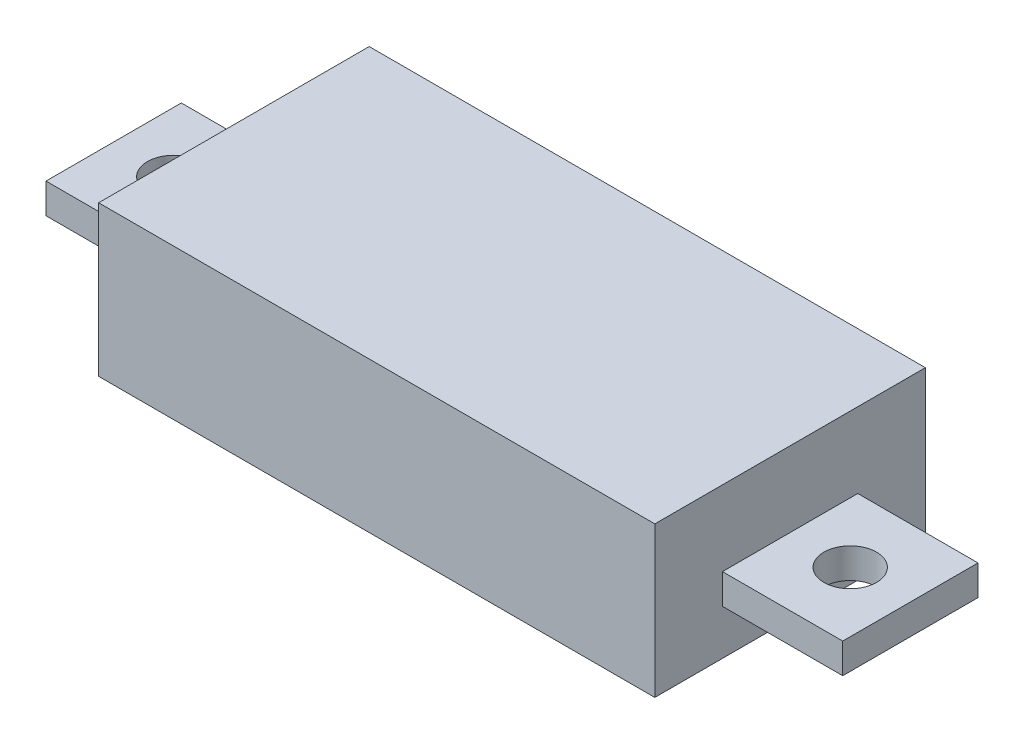
ISO-10303-21;
HEADER;
FILE_DESCRIPTION(('STEP AP214'),'2;1');
FILE_NAME('part.step','',(''),(''),'','','');
FILE_SCHEMA(('AUTOMOTIVE_DESIGN { 1 0 10303 214 1 1 1 1 }'));
ENDSEC;
DATA;
#1=APPLICATION_CONTEXT('core data for automotive mechanical design processes');
#2=APPLICATION_PROTOCOL_DEFINITION('international standard','automotive_design',2000,#1);
#3=PRODUCT_CONTEXT('',#1,'mechanical');
#4=PRODUCT('Part','Part','',(#3));
#5=PRODUCT_RELATED_PRODUCT_CATEGORY('part','',(#4));
#6=PRODUCT_DEFINITION_FORMATION('','',#4);
#7=PRODUCT_DEFINITION_CONTEXT('part definition',#1,'design');
#8=PRODUCT_DEFINITION('design','',#6,#7);
#9=PRODUCT_DEFINITION_SHAPE('','',#8);
#10=(LENGTH_UNIT() NAMED_UNIT(*) SI_UNIT(.MILLI.,.METRE.));
#11=(NAMED_UNIT(*) PLANE_ANGLE_UNIT() SI_UNIT($,.RADIAN.));
#12=(NAMED_UNIT(*) SI_UNIT($,.STERADIAN.) SOLID_ANGLE_UNIT());
#13=UNCERTAINTY_MEASURE_WITH_UNIT(LENGTH_MEASURE(1.E-05),#10,'distance_accuracy_value','');
#14=(GEOMETRIC_REPRESENTATION_CONTEXT(3) GLOBAL_UNCERTAINTY_ASSIGNED_CONTEXT((#13)) GLOBAL_UNIT_ASSIGNED_CONTEXT((#10,
#11,#12)) REPRESENTATION_CONTEXT('',''));
#15=CARTESIAN_POINT('',(0.,0.,0.));
#16=DIRECTION('',(0.,0.,1.));
#17=DIRECTION('',(1.,0.,0.));
#18=AXIS2_PLACEMENT_3D('',#15,#16,#17);
#19=CARTESIAN_POINT('',(-45.766289308135,10.,-28.3750993710437));
#20=DIRECTION('',(1.,0.,0.));
#21=DIRECTION('',(0.,0.,-1.));
#22=AXIS2_PLACEMENT_3D('',#19,#20,#21);
#23=PLANE('',#22);
#24=DIRECTION('',(0.,0.,1.));
#25=VECTOR('',#24,1.);
#26=CARTESIAN_POINT('',(-45.766289308135,5.,-28.3750993710437));
#27=LINE('',#26,#25);
#28=CARTESIAN_POINT('',(-45.766289308135,5.,-23.8750993710437));
#29=VERTEX_POINT('',#28);
#30=CARTESIAN_POINT('',(-45.766289308135,5.,-14.8750993710437));
#31=VERTEX_POINT('',#30);
#32=EDGE_CURVE('E184',#29,#31,#27,.T.);
#33=ORIENTED_EDGE('',*,*,#32,.T.);
#34=DIRECTION('',(0.,-1.,0.));
#35=VECTOR('',#34,1.);
#36=CARTESIAN_POINT('',(-45.766289308135,10.,-14.8750993710437));
#37=LINE('',#36,#35);
#38=CARTESIAN_POINT('',(-45.766289308135,3.,-14.8750993710437));
#39=VERTEX_POINT('',#38);
#40=EDGE_CURVE('E133',#31,#39,#37,.T.);
#41=ORIENTED_EDGE('',*,*,#40,.T.);
#42=DIRECTION('',(0.,0.,-1.));
#43=VECTOR('',#42,1.);
#44=CARTESIAN_POINT('',(-45.766289308135,3.,-28.3750993710437));
#45=LINE('',#44,#43);
#46=CARTESIAN_POINT('',(-45.766289308135,3.,-23.8750993710437));
#47=VERTEX_POINT('',#46);
#48=EDGE_CURVE('E201',#39,#47,#45,.T.);
#49=ORIENTED_EDGE('',*,*,#48,.T.);
#50=DIRECTION('',(0.,1.,0.));
#51=VECTOR('',#50,1.);
#52=CARTESIAN_POINT('',(-45.766289308135,10.,-23.8750993710437));
#53=LINE('',#52,#51);
#54=EDGE_CURVE('E197',#47,#29,#53,.T.);
#55=ORIENTED_EDGE('',*,*,#54,.T.);
#56=EDGE_LOOP('',(#33,#41,#49,#55));
#57=FACE_BOUND('',#56,.T.);
#58=DIRECTION('',(0.,0.,1.));
#59=VECTOR('',#58,1.);
#60=CARTESIAN_POINT('',(-45.766289308135,0.,-28.3750993710437));
#61=LINE('',#60,#59);
#62=CARTESIAN_POINT('',(-45.766289308135,0.,-28.3750993710437));
#63=VERTEX_POINT('',#62);
#64=CARTESIAN_POINT('',(-45.766289308135,0.,-10.3750993710437));
#65=VERTEX_POINT('',#64);
#66=EDGE_CURVE('E207',#63,#65,#61,.T.);
#67=ORIENTED_EDGE('',*,*,#66,.T.);
#68=DIRECTION('',(0.,-1.,0.));
#69=VECTOR('',#68,1.);
#70=CARTESIAN_POINT('',(-45.766289308135,10.,-10.3750993710437));
#71=LINE('',#70,#69);
#72=CARTESIAN_POINT('',(-45.766289308135,10.,-10.3750993710437));
#73=VERTEX_POINT('',#72);
#74=EDGE_CURVE('E245',#73,#65,#71,.T.);
#75=ORIENTED_EDGE('',*,*,#74,.F.);
#76=DIRECTION('',(0.,0.,1.));
#77=VECTOR('',#76,1.);
#78=CARTESIAN_POINT('',(-45.766289308135,10.,-28.3750993710437));
#79=LINE('',#78,#77);
#80=CARTESIAN_POINT('',(-45.766289308135,10.,-28.3750993710437));
#81=VERTEX_POINT('',#80);
#82=EDGE_CURVE('E208',#81,#73,#79,.T.);
#83=ORIENTED_EDGE('',*,*,#82,.F.);
#84=DIRECTION('',(0.,-1.,0.));
#85=VECTOR('',#84,1.);
#86=CARTESIAN_POINT('',(-45.766289308135,10.,-28.3750993710437));
#87=LINE('',#86,#85);
#88=EDGE_CURVE('E222',#81,#63,#87,.T.);
#89=ORIENTED_EDGE('',*,*,#88,.T.);
#90=EDGE_LOOP('',(#67,#75,#83,#89));
#91=FACE_BOUND('',#90,.T.);
#92=ADVANCED_FACE('F39',(#57,#91),#23,.F.);
#93=CARTESIAN_POINT('',(-45.766289308135,10.,-10.3750993710437));
#94=DIRECTION('',(0.,0.,-1.));
#95=DIRECTION('',(-1.,0.,0.));
#96=AXIS2_PLACEMENT_3D('',#93,#94,#95);
#97=PLANE('',#96);
#98=DIRECTION('',(1.,0.,0.));
#99=VECTOR('',#98,1.);
#100=CARTESIAN_POINT('',(-45.766289308135,0.,-10.3750993710437));
#101=LINE('',#100,#99);
#102=CARTESIAN_POINT('',(-8.76628930813503,0.,-10.3750993710437));
#103=VERTEX_POINT('',#102);
#104=EDGE_CURVE('E226',#65,#103,#101,.T.);
#105=ORIENTED_EDGE('',*,*,#104,.T.);
#106=DIRECTION('',(0.,-1.,0.));
#107=VECTOR('',#106,1.);
#108=CARTESIAN_POINT('',(-8.76628930813503,10.,-10.3750993710437));
#109=LINE('',#108,#107);
#110=CARTESIAN_POINT('',(-8.76628930813503,10.,-10.3750993710437));
#111=VERTEX_POINT('',#110);
#112=EDGE_CURVE('E241',#111,#103,#109,.T.);
#113=ORIENTED_EDGE('',*,*,#112,.F.);
#114=DIRECTION('',(1.,0.,0.));
#115=VECTOR('',#114,1.);
#116=CARTESIAN_POINT('',(-45.766289308135,10.,-10.3750993710437));
#117=LINE('',#116,#115);
#118=EDGE_CURVE('E212',#73,#111,#117,.T.);
#119=ORIENTED_EDGE('',*,*,#118,.F.);
#120=ORIENTED_EDGE('',*,*,#74,.T.);
#121=EDGE_LOOP('',(#105,#113,#119,#120));
#122=FACE_BOUND('',#121,.T.);
#123=ADVANCED_FACE('F291',(#122),#97,.F.);
#124=CARTESIAN_POINT('',(-8.76628930813503,10.,-28.3750993710437));
#125=DIRECTION('',(-1.,0.,0.));
#126=DIRECTION('',(0.,0.,1.));
#127=AXIS2_PLACEMENT_3D('',#124,#125,#126);
#128=PLANE('',#127);
#129=DIRECTION('',(0.,0.,1.));
#130=VECTOR('',#129,1.);
#131=CARTESIAN_POINT('',(-8.76628930813503,3.,-28.3750993710437));
#132=LINE('',#131,#130);
#133=CARTESIAN_POINT('',(-8.76628930813503,3.,-23.8750993710437));
#134=VERTEX_POINT('',#133);
#135=CARTESIAN_POINT('',(-8.76628930813503,3.,-14.8750993710437));
#136=VERTEX_POINT('',#135);
#137=EDGE_CURVE('E48',#134,#136,#132,.T.);
#138=ORIENTED_EDGE('',*,*,#137,.T.);
#139=DIRECTION('',(0.,1.,0.));
#140=VECTOR('',#139,1.);
#141=CARTESIAN_POINT('',(-8.76628930813503,10.,-14.8750993710437));
#142=LINE('',#141,#140);
#143=CARTESIAN_POINT('',(-8.76628930813503,5.,-14.8750993710437));
#144=VERTEX_POINT('',#143);
#145=EDGE_CURVE('E11',#136,#144,#142,.T.);
#146=ORIENTED_EDGE('',*,*,#145,.T.);
#147=DIRECTION('',(0.,0.,-1.));
#148=VECTOR('',#147,1.);
#149=CARTESIAN_POINT('',(-8.76628930813503,5.,-28.3750993710437));
#150=LINE('',#149,#148);
#151=CARTESIAN_POINT('',(-8.76628930813503,5.,-23.8750993710437));
#152=VERTEX_POINT('',#151);
#153=EDGE_CURVE('E249',#144,#152,#150,.T.);
#154=ORIENTED_EDGE('',*,*,#153,.T.);
#155=DIRECTION('',(0.,-1.,0.));
#156=VECTOR('',#155,1.);
#157=CARTESIAN_POINT('',(-8.76628930813503,10.,-23.8750993710437));
#158=LINE('',#157,#156);
#159=EDGE_CURVE('E253',#152,#134,#158,.T.);
#160=ORIENTED_EDGE('',*,*,#159,.T.);
#161=EDGE_LOOP('',(#138,#146,#154,#160));
#162=FACE_BOUND('',#161,.T.);
#163=DIRECTION('',(0.,0.,-1.));
#164=VECTOR('',#163,1.);
#165=CARTESIAN_POINT('',(-8.76628930813503,0.,-28.3750993710437));
#166=LINE('',#165,#164);
#167=CARTESIAN_POINT('',(-8.76628930813503,0.,-28.3750993710437));
#168=VERTEX_POINT('',#167);
#169=EDGE_CURVE('E229',#103,#168,#166,.T.);
#170=ORIENTED_EDGE('',*,*,#169,.T.);
#171=DIRECTION('',(0.,-1.,0.));
#172=VECTOR('',#171,1.);
#173=CARTESIAN_POINT('',(-8.76628930813503,10.,-28.3750993710437));
#174=LINE('',#173,#172);
#175=CARTESIAN_POINT('',(-8.76628930813503,10.,-28.3750993710437));
#176=VERTEX_POINT('',#175);
#177=EDGE_CURVE('E237',#176,#168,#174,.T.);
#178=ORIENTED_EDGE('',*,*,#177,.F.);
#179=DIRECTION('',(0.,0.,-1.));
#180=VECTOR('',#179,1.);
#181=CARTESIAN_POINT('',(-8.76628930813503,10.,-28.3750993710437));
#182=LINE('',#181,#180);
#183=EDGE_CURVE('E216',#111,#176,#182,.T.);
#184=ORIENTED_EDGE('',*,*,#183,.F.);
#185=ORIENTED_EDGE('',*,*,#112,.T.);
#186=EDGE_LOOP('',(#170,#178,#184,#185));
#187=FACE_BOUND('',#186,.T.);
#188=ADVANCED_FACE('F260',(#162,#187),#128,.F.);
#189=CARTESIAN_POINT('',(-45.766289308135,10.,-28.3750993710437));
#190=DIRECTION('',(0.,0.,1.));
#191=DIRECTION('',(1.,0.,0.));
#192=AXIS2_PLACEMENT_3D('',#189,#190,#191);
#193=PLANE('',#192);
#194=DIRECTION('',(-1.,0.,0.));
#195=VECTOR('',#194,1.);
#196=CARTESIAN_POINT('',(-45.766289308135,0.,-28.3750993710437));
#197=LINE('',#196,#195);
#198=EDGE_CURVE('E213',#168,#63,#197,.T.);
#199=ORIENTED_EDGE('',*,*,#198,.T.);
#200=ORIENTED_EDGE('',*,*,#88,.F.);
#201=DIRECTION('',(-1.,0.,0.));
#202=VECTOR('',#201,1.);
#203=CARTESIAN_POINT('',(-45.766289308135,10.,-28.3750993710437));
#204=LINE('',#203,#202);
#205=EDGE_CURVE('E219',#176,#81,#204,.T.);
#206=ORIENTED_EDGE('',*,*,#205,.F.);
#207=ORIENTED_EDGE('',*,*,#177,.T.);
#208=EDGE_LOOP('',(#199,#200,#206,#207));
#209=FACE_BOUND('',#208,.T.);
#210=ADVANCED_FACE('F312',(#209),#193,.F.);
#211=CARTESIAN_POINT('',(0.,10.,0.));
#212=DIRECTION('',(0.,1.,0.));
#213=DIRECTION('',(0.,0.,1.));
#214=AXIS2_PLACEMENT_3D('',#211,#212,#213);
#215=PLANE('',#214);
#216=ORIENTED_EDGE('',*,*,#82,.T.);
#217=ORIENTED_EDGE('',*,*,#118,.T.);
#218=ORIENTED_EDGE('',*,*,#183,.T.);
#219=ORIENTED_EDGE('',*,*,#205,.T.);
#220=EDGE_LOOP('',(#216,#217,#218,#219));
#221=FACE_BOUND('',#220,.T.);
#222=ADVANCED_FACE('F308',(#221),#215,.T.);
#223=CARTESIAN_POINT('',(0.,0.,0.));
#224=DIRECTION('',(0.,1.,0.));
#225=DIRECTION('',(0.,0.,1.));
#226=AXIS2_PLACEMENT_3D('',#223,#224,#225);
#227=PLANE('',#226);
#228=ORIENTED_EDGE('',*,*,#66,.F.);
#229=ORIENTED_EDGE('',*,*,#198,.F.);
#230=ORIENTED_EDGE('',*,*,#169,.F.);
#231=ORIENTED_EDGE('',*,*,#104,.F.);
#232=EDGE_LOOP('',(#228,#229,#230,#231));
#233=FACE_BOUND('',#232,.T.);
#234=ADVANCED_FACE('F284',(#233),#227,.F.);
#235=CARTESIAN_POINT('',(-0.766289308135035,0.,0.));
#236=DIRECTION('',(1.,0.,0.));
#237=DIRECTION('',(0.,0.,-1.));
#238=AXIS2_PLACEMENT_3D('',#235,#236,#237);
#239=PLANE('',#238);
#240=DIRECTION('',(0.,1.,0.));
#241=VECTOR('',#240,1.);
#242=CARTESIAN_POINT('',(-0.766289308135035,5.,-14.8750993710437));
#243=LINE('',#242,#241);
#244=CARTESIAN_POINT('',(-0.766289308135035,3.,-14.8750993710437));
#245=VERTEX_POINT('',#244);
#246=CARTESIAN_POINT('',(-0.766289308135035,5.,-14.8750993710437));
#247=VERTEX_POINT('',#246);
#248=EDGE_CURVE('E166',#245,#247,#243,.T.);
#249=ORIENTED_EDGE('',*,*,#248,.F.);
#250=DIRECTION('',(0.,0.,1.));
#251=VECTOR('',#250,1.);
#252=CARTESIAN_POINT('',(-0.766289308135035,3.,-14.8750993710437));
#253=LINE('',#252,#251);
#254=CARTESIAN_POINT('',(-0.766289308135035,3.,-23.8750993710437));
#255=VERTEX_POINT('',#254);
#256=EDGE_CURVE('E137',#255,#245,#253,.T.);
#257=ORIENTED_EDGE('',*,*,#256,.F.);
#258=DIRECTION('',(0.,-1.,0.));
#259=VECTOR('',#258,1.);
#260=CARTESIAN_POINT('',(-0.766289308135035,5.,-23.8750993710437));
#261=LINE('',#260,#259);
#262=CARTESIAN_POINT('',(-0.766289308135035,5.,-23.8750993710437));
#263=VERTEX_POINT('',#262);
#264=EDGE_CURVE('E173',#263,#255,#261,.T.);
#265=ORIENTED_EDGE('',*,*,#264,.F.);
#266=DIRECTION('',(0.,0.,-1.));
#267=VECTOR('',#266,1.);
#268=CARTESIAN_POINT('',(-0.766289308135035,5.,-14.8750993710437));
#269=LINE('',#268,#267);
#270=EDGE_CURVE('E170',#247,#263,#269,.T.);
#271=ORIENTED_EDGE('',*,*,#270,.F.);
#272=EDGE_LOOP('',(#249,#257,#265,#271));
#273=FACE_BOUND('',#272,.T.);
#274=ADVANCED_FACE('F271',(#273),#239,.T.);
#275=CARTESIAN_POINT('',(-0.766289308135035,5.,-14.8750993710437));
#276=DIRECTION('',(0.,1.,0.));
#277=DIRECTION('',(0.,0.,1.));
#278=AXIS2_PLACEMENT_3D('',#275,#276,#277);
#279=PLANE('',#278);
#280=CARTESIAN_POINT('',(-4.76628930813503,5.,-19.3750993710437));
#281=DIRECTION('',(0.,1.,0.));
#282=DIRECTION('',(0.,0.,1.));
#283=AXIS2_PLACEMENT_3D('',#280,#281,#282);
#284=CIRCLE('',#283,1.75);
#285=CARTESIAN_POINT('',(-4.76628930813503,5.,-17.6250993710437));
#286=VERTEX_POINT('',#285);
#287=EDGE_CURVE('E453',#286,#286,#284,.T.);
#288=ORIENTED_EDGE('',*,*,#287,.F.);
#289=EDGE_LOOP('',(#288));
#290=FACE_BOUND('',#289,.T.);
#291=ORIENTED_EDGE('',*,*,#153,.F.);
#292=DIRECTION('',(-1.,0.,0.));
#293=VECTOR('',#292,1.);
#294=CARTESIAN_POINT('',(-0.766289308135035,5.,-14.8750993710437));
#295=LINE('',#294,#293);
#296=EDGE_CURVE('E136',#247,#144,#295,.T.);
#297=ORIENTED_EDGE('',*,*,#296,.F.);
#298=ORIENTED_EDGE('',*,*,#270,.T.);
#299=DIRECTION('',(-1.,0.,0.));
#300=VECTOR('',#299,1.);
#301=CARTESIAN_POINT('',(-0.766289308135035,5.,-23.8750993710437));
#302=LINE('',#301,#300);
#303=EDGE_CURVE('E63',#263,#152,#302,.T.);
#304=ORIENTED_EDGE('',*,*,#303,.T.);
#305=EDGE_LOOP('',(#291,#297,#298,#304));
#306=FACE_BOUND('',#305,.T.);
#307=ADVANCED_FACE('F274',(#290,#306),#279,.T.);
#308=CARTESIAN_POINT('',(-0.766289308135035,5.,-23.8750993710437));
#309=DIRECTION('',(0.,0.,-1.));
#310=DIRECTION('',(-1.,0.,0.));
#311=AXIS2_PLACEMENT_3D('',#308,#309,#310);
#312=PLANE('',#311);
#313=ORIENTED_EDGE('',*,*,#159,.F.);
#314=ORIENTED_EDGE('',*,*,#303,.F.);
#315=ORIENTED_EDGE('',*,*,#264,.T.);
#316=DIRECTION('',(-1.,0.,0.));
#317=VECTOR('',#316,1.);
#318=CARTESIAN_POINT('',(-0.766289308135035,3.,-23.8750993710437));
#319=LINE('',#318,#317);
#320=EDGE_CURVE('E186',#255,#134,#319,.T.);
#321=ORIENTED_EDGE('',*,*,#320,.T.);
#322=EDGE_LOOP('',(#313,#314,#315,#321));
#323=FACE_BOUND('',#322,.T.);
#324=ADVANCED_FACE('F265',(#323),#312,.T.);
#325=CARTESIAN_POINT('',(-0.766289308135035,3.,-14.8750993710437));
#326=DIRECTION('',(0.,-1.,0.));
#327=DIRECTION('',(0.,0.,-1.));
#328=AXIS2_PLACEMENT_3D('',#325,#326,#327);
#329=PLANE('',#328);
#330=CARTESIAN_POINT('',(-4.76628930813503,3.,-19.3750993710437));
#331=DIRECTION('',(0.,-1.,0.));
#332=DIRECTION('',(0.,0.,-1.));
#333=AXIS2_PLACEMENT_3D('',#330,#331,#332);
#334=CIRCLE('',#333,1.75);
#335=CARTESIAN_POINT('',(-4.76628930813503,3.,-21.1250993710437));
#336=VERTEX_POINT('',#335);
#337=EDGE_CURVE('E42',#336,#336,#334,.T.);
#338=ORIENTED_EDGE('',*,*,#337,.F.);
#339=EDGE_LOOP('',(#338));
#340=FACE_BOUND('',#339,.T.);
#341=ORIENTED_EDGE('',*,*,#137,.F.);
#342=ORIENTED_EDGE('',*,*,#320,.F.);
#343=ORIENTED_EDGE('',*,*,#256,.T.);
#344=DIRECTION('',(-1.,0.,0.));
#345=VECTOR('',#344,1.);
#346=CARTESIAN_POINT('',(-0.766289308135035,3.,-14.8750993710437));
#347=LINE('',#346,#345);
#348=EDGE_CURVE('E180',#245,#136,#347,.T.);
#349=ORIENTED_EDGE('',*,*,#348,.T.);
#350=EDGE_LOOP('',(#341,#342,#343,#349));
#351=FACE_BOUND('',#350,.T.);
#352=ADVANCED_FACE('F263',(#340,#351),#329,.T.);
#353=CARTESIAN_POINT('',(-0.766289308135035,5.,-14.8750993710437));
#354=DIRECTION('',(0.,0.,1.));
#355=DIRECTION('',(1.,0.,0.));
#356=AXIS2_PLACEMENT_3D('',#353,#354,#355);
#357=PLANE('',#356);
#358=ORIENTED_EDGE('',*,*,#145,.F.);
#359=ORIENTED_EDGE('',*,*,#348,.F.);
#360=ORIENTED_EDGE('',*,*,#248,.T.);
#361=ORIENTED_EDGE('',*,*,#296,.T.);
#362=EDGE_LOOP('',(#358,#359,#360,#361));
#363=FACE_BOUND('',#362,.T.);
#364=ADVANCED_FACE('F273',(#363),#357,.T.);
#365=ORIENTED_EDGE('',*,*,#40,.F.);
#366=CARTESIAN_POINT('',(-53.766289308135,5.,-14.8750993710437));
#367=VERTEX_POINT('',#366);
#368=EDGE_CURVE('E55',#31,#367,#295,.T.);
#369=ORIENTED_EDGE('',*,*,#368,.T.);
#370=DIRECTION('',(0.,1.,0.));
#371=VECTOR('',#370,1.);
#372=CARTESIAN_POINT('',(-53.766289308135,5.,-14.8750993710437));
#373=LINE('',#372,#371);
#374=CARTESIAN_POINT('',(-53.766289308135,3.,-14.8750993710437));
#375=VERTEX_POINT('',#374);
#376=EDGE_CURVE('E131',#375,#367,#373,.T.);
#377=ORIENTED_EDGE('',*,*,#376,.F.);
#378=EDGE_CURVE('E185',#39,#375,#347,.T.);
#379=ORIENTED_EDGE('',*,*,#378,.F.);
#380=EDGE_LOOP('',(#365,#369,#377,#379));
#381=FACE_BOUND('',#380,.T.);
#382=ADVANCED_FACE('F128',(#381),#357,.T.);
#383=CARTESIAN_POINT('',(-49.766289308135,3.,-19.3750993710437));
#384=DIRECTION('',(0.,-1.,0.));
#385=DIRECTION('',(0.,0.,-1.));
#386=AXIS2_PLACEMENT_3D('',#383,#384,#385);
#387=CIRCLE('',#386,1.75);
#388=CARTESIAN_POINT('',(-49.766289308135,3.,-21.1250993710437));
#389=VERTEX_POINT('',#388);
#390=EDGE_CURVE('E158',#389,#389,#387,.T.);
#391=ORIENTED_EDGE('',*,*,#390,.F.);
#392=EDGE_LOOP('',(#391));
#393=FACE_BOUND('',#392,.T.);
#394=ORIENTED_EDGE('',*,*,#48,.F.);
#395=ORIENTED_EDGE('',*,*,#378,.T.);
#396=DIRECTION('',(0.,0.,1.));
#397=VECTOR('',#396,1.);
#398=CARTESIAN_POINT('',(-53.766289308135,3.,-14.8750993710437));
#399=LINE('',#398,#397);
#400=CARTESIAN_POINT('',(-53.766289308135,3.,-23.8750993710437));
#401=VERTEX_POINT('',#400);
#402=EDGE_CURVE('E153',#401,#375,#399,.T.);
#403=ORIENTED_EDGE('',*,*,#402,.F.);
#404=EDGE_CURVE('E190',#47,#401,#319,.T.);
#405=ORIENTED_EDGE('',*,*,#404,.F.);
#406=EDGE_LOOP('',(#394,#395,#403,#405));
#407=FACE_BOUND('',#406,.T.);
#408=ADVANCED_FACE('F324',(#393,#407),#329,.T.);
#409=ORIENTED_EDGE('',*,*,#54,.F.);
#410=ORIENTED_EDGE('',*,*,#404,.T.);
#411=DIRECTION('',(0.,-1.,0.));
#412=VECTOR('',#411,1.);
#413=CARTESIAN_POINT('',(-53.766289308135,5.,-23.8750993710437));
#414=LINE('',#413,#412);
#415=CARTESIAN_POINT('',(-53.766289308135,5.,-23.8750993710437));
#416=VERTEX_POINT('',#415);
#417=EDGE_CURVE('E148',#416,#401,#414,.T.);
#418=ORIENTED_EDGE('',*,*,#417,.F.);
#419=EDGE_CURVE('E143',#29,#416,#302,.T.);
#420=ORIENTED_EDGE('',*,*,#419,.F.);
#421=EDGE_LOOP('',(#409,#410,#418,#420));
#422=FACE_BOUND('',#421,.T.);
#423=ADVANCED_FACE('F283',(#422),#312,.T.);
#424=CARTESIAN_POINT('',(-49.766289308135,5.,-19.3750993710437));
#425=DIRECTION('',(0.,1.,0.));
#426=DIRECTION('',(0.,0.,1.));
#427=AXIS2_PLACEMENT_3D('',#424,#425,#426);
#428=CIRCLE('',#427,1.75);
#429=CARTESIAN_POINT('',(-49.766289308135,5.,-17.6250993710437));
#430=VERTEX_POINT('',#429);
#431=EDGE_CURVE('E455',#430,#430,#428,.T.);
#432=ORIENTED_EDGE('',*,*,#431,.F.);
#433=EDGE_LOOP('',(#432));
#434=FACE_BOUND('',#433,.T.);
#435=ORIENTED_EDGE('',*,*,#32,.F.);
#436=ORIENTED_EDGE('',*,*,#419,.T.);
#437=DIRECTION('',(0.,0.,-1.));
#438=VECTOR('',#437,1.);
#439=CARTESIAN_POINT('',(-53.766289308135,5.,-14.8750993710437));
#440=LINE('',#439,#438);
#441=EDGE_CURVE('E140',#367,#416,#440,.T.);
#442=ORIENTED_EDGE('',*,*,#441,.F.);
#443=ORIENTED_EDGE('',*,*,#368,.F.);
#444=EDGE_LOOP('',(#435,#436,#442,#443));
#445=FACE_BOUND('',#444,.T.);
#446=ADVANCED_FACE('F141',(#434,#445),#279,.T.);
#447=CARTESIAN_POINT('',(-53.766289308135,0.,0.));
#448=DIRECTION('',(1.,0.,0.));
#449=DIRECTION('',(0.,0.,-1.));
#450=AXIS2_PLACEMENT_3D('',#447,#448,#449);
#451=PLANE('',#450);
#452=ORIENTED_EDGE('',*,*,#376,.T.);
#453=ORIENTED_EDGE('',*,*,#441,.T.);
#454=ORIENTED_EDGE('',*,*,#417,.T.);
#455=ORIENTED_EDGE('',*,*,#402,.T.);
#456=EDGE_LOOP('',(#452,#453,#454,#455));
#457=FACE_BOUND('',#456,.T.);
#458=ADVANCED_FACE('F151',(#457),#451,.F.);
#459=CARTESIAN_POINT('',(-49.766289308135,-3.,-19.3750993710437));
#460=DIRECTION('',(0.,1.,0.));
#461=DIRECTION('',(0.,0.,1.));
#462=AXIS2_PLACEMENT_3D('',#459,#460,#461);
#463=CYLINDRICAL_SURFACE('',#462,1.75);
#464=ORIENTED_EDGE('',*,*,#390,.T.);
#465=EDGE_LOOP('',(#464));
#466=FACE_BOUND('',#465,.T.);
#467=ORIENTED_EDGE('',*,*,#431,.T.);
#468=EDGE_LOOP('',(#467));
#469=FACE_BOUND('',#468,.T.);
#470=ADVANCED_FACE('F361',(#466,#469),#463,.F.);
#471=CARTESIAN_POINT('',(-4.76628930813503,-3.,-19.3750993710437));
#472=DIRECTION('',(0.,1.,0.));
#473=DIRECTION('',(0.,0.,1.));
#474=AXIS2_PLACEMENT_3D('',#471,#472,#473);
#475=CYLINDRICAL_SURFACE('',#474,1.75);
#476=ORIENTED_EDGE('',*,*,#337,.T.);
#477=EDGE_LOOP('',(#476));
#478=FACE_BOUND('',#477,.T.);
#479=ORIENTED_EDGE('',*,*,#287,.T.);
#480=EDGE_LOOP('',(#479));
#481=FACE_BOUND('',#480,.T.);
#482=ADVANCED_FACE('F366',(#478,#481),#475,.F.);
#483=CLOSED_SHELL('',(#92,#123,#188,#210,#222,#234,#274,#307,#324,#352,#364,#382,#408,#423,#446,
#458,#470,#482));
#484=MANIFOLD_SOLID_BREP('B2',#483);
#485=ADVANCED_BREP_SHAPE_REPRESENTATION('',(#18,#484),#14);
#486=SHAPE_DEFINITION_REPRESENTATION(#9,#485);
ENDSEC;
END-ISO-10303-21;
